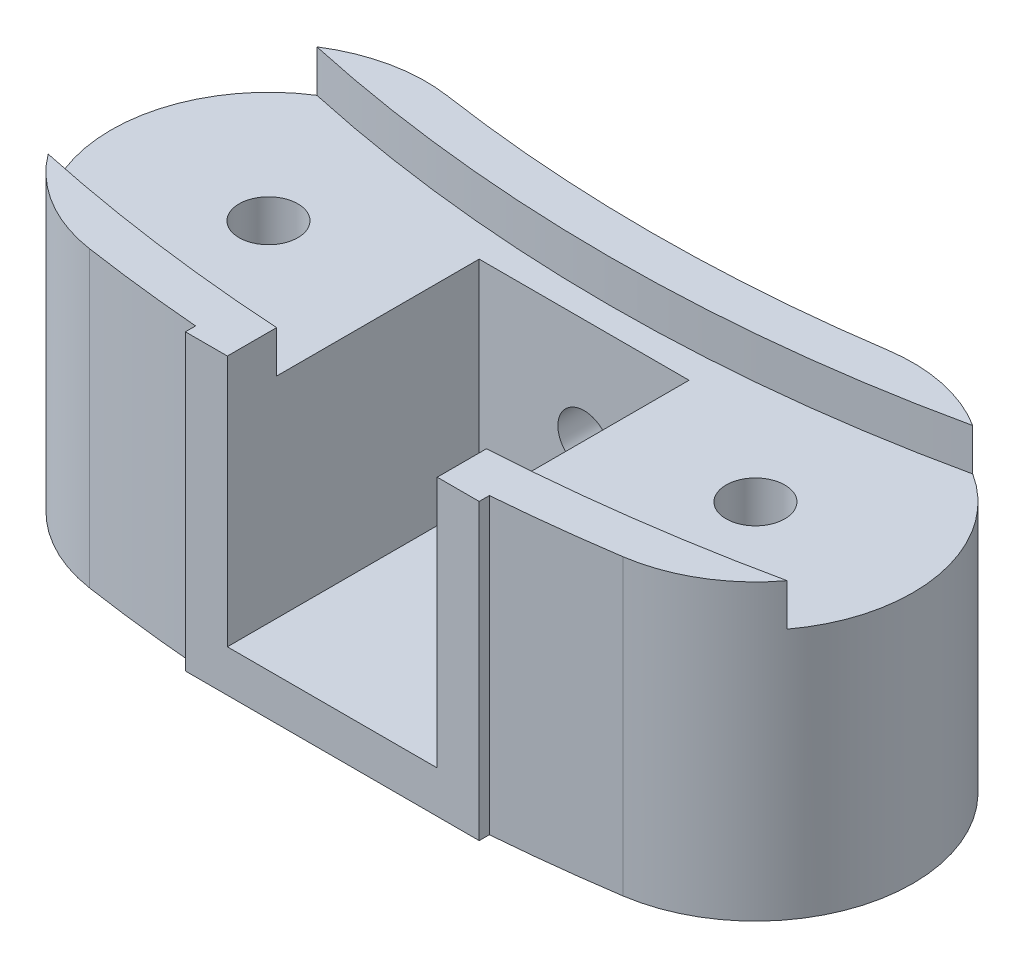
ISO-10303-21;
HEADER;
FILE_DESCRIPTION(('STEP AP214'),'2;1');
FILE_NAME('part.step','',(''),(''),'','','');
FILE_SCHEMA(('AUTOMOTIVE_DESIGN { 1 0 10303 214 1 1 1 1 }'));
ENDSEC;
DATA;
#1=APPLICATION_CONTEXT('core data for automotive mechanical design processes');
#2=APPLICATION_PROTOCOL_DEFINITION('international standard','automotive_design',2000,#1);
#3=PRODUCT_CONTEXT('',#1,'mechanical');
#4=PRODUCT('Part','Part','',(#3));
#5=PRODUCT_RELATED_PRODUCT_CATEGORY('part','',(#4));
#6=PRODUCT_DEFINITION_FORMATION('','',#4);
#7=PRODUCT_DEFINITION_CONTEXT('part definition',#1,'design');
#8=PRODUCT_DEFINITION('design','',#6,#7);
#9=PRODUCT_DEFINITION_SHAPE('','',#8);
#10=(LENGTH_UNIT() NAMED_UNIT(*) SI_UNIT(.MILLI.,.METRE.));
#11=(NAMED_UNIT(*) PLANE_ANGLE_UNIT() SI_UNIT($,.RADIAN.));
#12=(NAMED_UNIT(*) SI_UNIT($,.STERADIAN.) SOLID_ANGLE_UNIT());
#13=UNCERTAINTY_MEASURE_WITH_UNIT(LENGTH_MEASURE(1.E-05),#10,'distance_accuracy_value','');
#14=(GEOMETRIC_REPRESENTATION_CONTEXT(3) GLOBAL_UNCERTAINTY_ASSIGNED_CONTEXT((#13)) GLOBAL_UNIT_ASSIGNED_CONTEXT((#10,
#11,#12)) REPRESENTATION_CONTEXT('',''));
#15=CARTESIAN_POINT('',(0.,0.,0.));
#16=DIRECTION('',(0.,0.,1.));
#17=DIRECTION('',(1.,0.,0.));
#18=AXIS2_PLACEMENT_3D('',#15,#16,#17);
#19=CARTESIAN_POINT('',(0.,14.,-78.5));
#20=DIRECTION('',(0.,-1.,0.));
#21=DIRECTION('',(0.,0.,-1.));
#22=AXIS2_PLACEMENT_3D('',#19,#20,#21);
#23=CYLINDRICAL_SURFACE('',#22,84.);
#24=DIRECTION('',(0.,-1.,0.));
#25=VECTOR('',#24,1.);
#26=CARTESIAN_POINT('',(5.00000000000002,14.,5.35105843100611));
#27=LINE('',#26,#25);
#28=CARTESIAN_POINT('',(5.00000000000002,14.,5.35105843100611));
#29=VERTEX_POINT('',#28);
#30=CARTESIAN_POINT('',(5.00000000000002,12.,5.35105843100611));
#31=VERTEX_POINT('',#30);
#32=EDGE_CURVE('E202',#29,#31,#27,.T.);
#33=ORIENTED_EDGE('',*,*,#32,.F.);
#34=CARTESIAN_POINT('',(0.,14.,-78.5));
#35=DIRECTION('',(0.,1.,0.));
#36=DIRECTION('',(0.,0.,1.));
#37=AXIS2_PLACEMENT_3D('',#34,#35,#36);
#38=CIRCLE('',#37,84.);
#39=CARTESIAN_POINT('',(17.60562734347,14.,3.63429177781265));
#40=VERTEX_POINT('',#39);
#41=EDGE_CURVE('E236',#29,#40,#38,.T.);
#42=ORIENTED_EDGE('',*,*,#41,.T.);
#43=DIRECTION('',(0.,-1.,0.));
#44=VECTOR('',#43,1.);
#45=CARTESIAN_POINT('',(17.60562734347,14.,3.63429177781265));
#46=LINE('',#45,#44);
#47=CARTESIAN_POINT('',(17.60562734347,12.,3.63429177781265));
#48=VERTEX_POINT('',#47);
#49=EDGE_CURVE('E246',#40,#48,#46,.T.);
#50=ORIENTED_EDGE('',*,*,#49,.T.);
#51=CARTESIAN_POINT('',(0.,12.,-78.5));
#52=DIRECTION('',(0.,1.,0.));
#53=DIRECTION('',(0.,0.,1.));
#54=AXIS2_PLACEMENT_3D('',#51,#52,#53);
#55=CIRCLE('',#54,84.);
#56=EDGE_CURVE('E224',#31,#48,#55,.T.);
#57=ORIENTED_EDGE('',*,*,#56,.F.);
#58=EDGE_LOOP('',(#33,#42,#50,#57));
#59=FACE_BOUND('',#58,.T.);
#60=ADVANCED_FACE('F39',(#59),#23,.F.);
#61=CARTESIAN_POINT('',(0.,14.,0.));
#62=DIRECTION('',(0.,1.,0.));
#63=DIRECTION('',(0.,0.,1.));
#64=AXIS2_PLACEMENT_3D('',#61,#62,#63);
#65=PLANE('',#64);
#66=DIRECTION('',(0.,0.,1.));
#67=VECTOR('',#66,1.);
#68=CARTESIAN_POINT('',(5.00000000000002,14.,-4.3));
#69=LINE('',#68,#67);
#70=CARTESIAN_POINT('',(5.00000000000002,14.,7.7));
#71=VERTEX_POINT('',#70);
#72=EDGE_CURVE('E184',#29,#71,#69,.T.);
#73=ORIENTED_EDGE('',*,*,#72,.T.);
#74=DIRECTION('',(-1.,0.,0.));
#75=VECTOR('',#74,1.);
#76=CARTESIAN_POINT('',(0.,14.,7.7));
#77=LINE('',#76,#75);
#78=CARTESIAN_POINT('',(7.00000000000003,14.,7.7));
#79=VERTEX_POINT('',#78);
#80=EDGE_CURVE('E218',#79,#71,#77,.T.);
#81=ORIENTED_EDGE('',*,*,#80,.F.);
#82=DIRECTION('',(0.,0.,1.));
#83=VECTOR('',#82,1.);
#84=CARTESIAN_POINT('',(7.00000000000003,14.,-500000.));
#85=LINE('',#84,#83);
#86=CARTESIAN_POINT('',(7.00000000000003,14.,7.21464285639883));
#87=VERTEX_POINT('',#86);
#88=EDGE_CURVE('E62',#87,#79,#85,.T.);
#89=ORIENTED_EDGE('',*,*,#88,.F.);
#90=CARTESIAN_POINT('',(0.,14.,-78.5));
#91=DIRECTION('',(0.,1.,0.));
#92=DIRECTION('',(0.,0.,1.));
#93=AXIS2_PLACEMENT_3D('',#90,#91,#92);
#94=CIRCLE('',#93,86.);
#95=CARTESIAN_POINT('',(12.711609357146,14.,6.55536424912499));
#96=VERTEX_POINT('',#95);
#97=EDGE_CURVE('E239',#87,#96,#94,.T.);
#98=ORIENTED_EDGE('',*,*,#97,.T.);
#99=CARTESIAN_POINT('',(11.6030387736739,14.,-0.862254726089445));
#100=DIRECTION('',(0.,1.,0.));
#101=DIRECTION('',(0.,0.,1.));
#102=AXIS2_PLACEMENT_3D('',#99,#100,#101);
#103=CIRCLE('',#102,7.50000000000006);
#104=EDGE_CURVE('E243',#96,#40,#103,.T.);
#105=ORIENTED_EDGE('',*,*,#104,.T.);
#106=ORIENTED_EDGE('',*,*,#41,.F.);
#107=EDGE_LOOP('',(#73,#81,#89,#98,#105,#106));
#108=FACE_BOUND('',#107,.T.);
#109=ADVANCED_FACE('F385',(#108),#65,.T.);
#110=CARTESIAN_POINT('',(0.,12.,-78.5));
#111=DIRECTION('',(0.,-1.,0.));
#112=DIRECTION('',(0.,0.,-1.));
#113=AXIS2_PLACEMENT_3D('',#110,#111,#112);
#114=CYLINDRICAL_SURFACE('',#113,86.);
#115=ORIENTED_EDGE('',*,*,#97,.F.);
#116=DIRECTION('',(0.,-1.,0.));
#117=VECTOR('',#116,1.);
#118=CARTESIAN_POINT('',(7.00000000000003,12.,7.21464285639883));
#119=LINE('',#118,#117);
#120=CARTESIAN_POINT('',(7.00000000000002,0.,7.21464285639883));
#121=VERTEX_POINT('',#120);
#122=EDGE_CURVE('E206',#121,#87,#119,.F.);
#123=ORIENTED_EDGE('',*,*,#122,.F.);
#124=CARTESIAN_POINT('',(0.,0.,-78.5));
#125=DIRECTION('',(0.,1.,0.));
#126=DIRECTION('',(0.,0.,1.));
#127=AXIS2_PLACEMENT_3D('',#124,#125,#126);
#128=CIRCLE('',#127,86.);
#129=CARTESIAN_POINT('',(12.711609357146,0.,6.55536424912495));
#130=VERTEX_POINT('',#129);
#131=EDGE_CURVE('E285',#121,#130,#128,.T.);
#132=ORIENTED_EDGE('',*,*,#131,.T.);
#133=DIRECTION('',(0.,-1.,0.));
#134=VECTOR('',#133,1.);
#135=CARTESIAN_POINT('',(12.711609357146,12.,6.55536424912495));
#136=LINE('',#135,#134);
#137=EDGE_CURVE('E47',#96,#130,#136,.T.);
#138=ORIENTED_EDGE('',*,*,#137,.F.);
#139=EDGE_LOOP('',(#115,#123,#132,#138));
#140=FACE_BOUND('',#139,.T.);
#141=ADVANCED_FACE('F321',(#140),#114,.T.);
#142=CARTESIAN_POINT('',(0.,12.,0.));
#143=DIRECTION('',(0.,1.,0.));
#144=DIRECTION('',(0.,0.,1.));
#145=AXIS2_PLACEMENT_3D('',#142,#143,#144);
#146=PLANE('',#145);
#147=DIRECTION('',(0.,0.,-1.));
#148=VECTOR('',#147,1.);
#149=CARTESIAN_POINT('',(5.00000000000002,12.,0.));
#150=LINE('',#149,#148);
#151=CARTESIAN_POINT('',(5.00000000000002,12.,-4.3));
#152=VERTEX_POINT('',#151);
#153=EDGE_CURVE('E204',#31,#152,#150,.T.);
#154=ORIENTED_EDGE('',*,*,#153,.F.);
#155=ORIENTED_EDGE('',*,*,#56,.T.);
#156=CARTESIAN_POINT('',(11.6030387736739,12.,-0.862254726089445));
#157=DIRECTION('',(0.,1.,0.));
#158=DIRECTION('',(0.,0.,1.));
#159=AXIS2_PLACEMENT_3D('',#156,#157,#158);
#160=CIRCLE('',#159,7.50000000000006);
#161=CARTESIAN_POINT('',(15.6259874786886,12.,-7.19201646858981));
#162=VERTEX_POINT('',#161);
#163=EDGE_CURVE('E287',#48,#162,#160,.T.);
#164=ORIENTED_EDGE('',*,*,#163,.T.);
#165=CARTESIAN_POINT('',(0.,12.,-78.5));
#166=DIRECTION('',(0.,1.,0.));
#167=DIRECTION('',(0.,0.,1.));
#168=AXIS2_PLACEMENT_3D('',#165,#166,#167);
#169=CIRCLE('',#168,73.);
#170=CARTESIAN_POINT('',(-15.6259874786886,12.,-7.19201646858981));
#171=VERTEX_POINT('',#170);
#172=EDGE_CURVE('E255',#171,#162,#169,.T.);
#173=ORIENTED_EDGE('',*,*,#172,.F.);
#174=CARTESIAN_POINT('',(-11.6030387736739,12.,-0.862254726089445));
#175=DIRECTION('',(0.,1.,0.));
#176=DIRECTION('',(0.,0.,1.));
#177=AXIS2_PLACEMENT_3D('',#174,#175,#176);
#178=CIRCLE('',#177,7.50000000000004);
#179=CARTESIAN_POINT('',(-17.6056273434699,12.,3.63429177781266));
#180=VERTEX_POINT('',#179);
#181=EDGE_CURVE('E276',#171,#180,#178,.T.);
#182=ORIENTED_EDGE('',*,*,#181,.T.);
#183=CARTESIAN_POINT('',(-4.99999999999997,12.,5.35105843100611));
#184=VERTEX_POINT('',#183);
#185=EDGE_CURVE('E247',#180,#184,#55,.T.);
#186=ORIENTED_EDGE('',*,*,#185,.T.);
#187=DIRECTION('',(0.,0.,1.));
#188=VECTOR('',#187,1.);
#189=CARTESIAN_POINT('',(-4.99999999999997,12.,0.));
#190=LINE('',#189,#188);
#191=CARTESIAN_POINT('',(-4.99999999999997,12.,-4.3));
#192=VERTEX_POINT('',#191);
#193=EDGE_CURVE('E200',#192,#184,#190,.T.);
#194=ORIENTED_EDGE('',*,*,#193,.F.);
#195=DIRECTION('',(1.,0.,0.));
#196=VECTOR('',#195,1.);
#197=CARTESIAN_POINT('',(0.,12.,-4.3));
#198=LINE('',#197,#196);
#199=EDGE_CURVE('E11',#192,#152,#198,.T.);
#200=ORIENTED_EDGE('',*,*,#199,.T.);
#201=EDGE_LOOP('',(#154,#155,#164,#173,#182,#186,#194,#200));
#202=FACE_BOUND('',#201,.T.);
#203=CARTESIAN_POINT('',(-11.6030387736739,12.,-0.862254726089445));
#204=DIRECTION('',(0.,1.,0.));
#205=DIRECTION('',(0.,0.,1.));
#206=AXIS2_PLACEMENT_3D('',#203,#204,#205);
#207=CIRCLE('',#206,1.4);
#208=CARTESIAN_POINT('',(-11.6030387736739,12.,0.537745273910554));
#209=VERTEX_POINT('',#208);
#210=EDGE_CURVE('E306',#209,#209,#207,.T.);
#211=ORIENTED_EDGE('',*,*,#210,.F.);
#212=EDGE_LOOP('',(#211));
#213=FACE_BOUND('',#212,.T.);
#214=CARTESIAN_POINT('',(11.6030387736739,12.,-0.862254726089445));
#215=DIRECTION('',(0.,1.,0.));
#216=DIRECTION('',(0.,0.,1.));
#217=AXIS2_PLACEMENT_3D('',#214,#215,#216);
#218=CIRCLE('',#217,1.4);
#219=CARTESIAN_POINT('',(11.6030387736739,12.,0.537745273910554));
#220=VERTEX_POINT('',#219);
#221=EDGE_CURVE('E291',#220,#220,#218,.T.);
#222=ORIENTED_EDGE('',*,*,#221,.F.);
#223=EDGE_LOOP('',(#222));
#224=FACE_BOUND('',#223,.T.);
#225=ADVANCED_FACE('F360',(#202,#213,#224),#146,.T.);
#226=CARTESIAN_POINT('',(-12.7116093571459,0.,6.55536424912497));
#227=VERTEX_POINT('',#226);
#228=CARTESIAN_POINT('',(-6.99999999999997,0.,7.21464285639883));
#229=VERTEX_POINT('',#228);
#230=EDGE_CURVE('E325',#227,#229,#128,.T.);
#231=ORIENTED_EDGE('',*,*,#230,.T.);
#232=DIRECTION('',(0.,-1.,0.));
#233=VECTOR('',#232,1.);
#234=CARTESIAN_POINT('',(-6.99999999999997,12.,7.21464285639883));
#235=LINE('',#234,#233);
#236=CARTESIAN_POINT('',(-6.99999999999997,14.,7.21464285641105));
#237=VERTEX_POINT('',#236);
#238=EDGE_CURVE('E208',#237,#229,#235,.T.);
#239=ORIENTED_EDGE('',*,*,#238,.F.);
#240=CARTESIAN_POINT('',(-12.7116093571459,14.,6.55536424912498));
#241=VERTEX_POINT('',#240);
#242=EDGE_CURVE('E240',#241,#237,#94,.T.);
#243=ORIENTED_EDGE('',*,*,#242,.F.);
#244=DIRECTION('',(0.,-1.,0.));
#245=VECTOR('',#244,1.);
#246=CARTESIAN_POINT('',(-12.7116093571459,12.,6.55536424912497));
#247=LINE('',#246,#245);
#248=EDGE_CURVE('E302',#241,#227,#247,.T.);
#249=ORIENTED_EDGE('',*,*,#248,.T.);
#250=EDGE_LOOP('',(#231,#239,#243,#249));
#251=FACE_BOUND('',#250,.T.);
#252=ADVANCED_FACE('F41',(#251),#114,.T.);
#253=CARTESIAN_POINT('',(11.6030387736739,12.,-0.862254726089445));
#254=DIRECTION('',(0.,-1.,0.));
#255=DIRECTION('',(0.,0.,-1.));
#256=AXIS2_PLACEMENT_3D('',#253,#254,#255);
#257=CYLINDRICAL_SURFACE('',#256,7.50000000000006);
#258=CARTESIAN_POINT('',(11.6030387736739,0.,-0.862254726089445));
#259=DIRECTION('',(0.,1.,0.));
#260=DIRECTION('',(0.,0.,1.));
#261=AXIS2_PLACEMENT_3D('',#258,#259,#260);
#262=CIRCLE('',#261,7.50000000000006);
#263=CARTESIAN_POINT('',(10.4944681902019,0.,-8.27987370130388));
#264=VERTEX_POINT('',#263);
#265=EDGE_CURVE('E316',#130,#264,#262,.T.);
#266=ORIENTED_EDGE('',*,*,#265,.T.);
#267=DIRECTION('',(0.,-1.,0.));
#268=VECTOR('',#267,1.);
#269=CARTESIAN_POINT('',(10.4944681902019,12.,-8.27987370130388));
#270=LINE('',#269,#268);
#271=CARTESIAN_POINT('',(10.4944681902019,14.,-8.27987370130388));
#272=VERTEX_POINT('',#271);
#273=EDGE_CURVE('E308',#272,#264,#270,.T.);
#274=ORIENTED_EDGE('',*,*,#273,.F.);
#275=CARTESIAN_POINT('',(11.6030387736739,14.,-0.862254726089445));
#276=DIRECTION('',(0.,1.,0.));
#277=DIRECTION('',(0.,0.,1.));
#278=AXIS2_PLACEMENT_3D('',#275,#276,#277);
#279=CIRCLE('',#278,7.50000000000006);
#280=CARTESIAN_POINT('',(15.6259874786886,14.,-7.19201646858981));
#281=VERTEX_POINT('',#280);
#282=EDGE_CURVE('E261',#281,#272,#279,.T.);
#283=ORIENTED_EDGE('',*,*,#282,.F.);
#284=DIRECTION('',(0.,-1.,0.));
#285=VECTOR('',#284,1.);
#286=CARTESIAN_POINT('',(15.6259874786886,14.,-7.19201646858981));
#287=LINE('',#286,#285);
#288=EDGE_CURVE('E267',#281,#162,#287,.T.);
#289=ORIENTED_EDGE('',*,*,#288,.T.);
#290=ORIENTED_EDGE('',*,*,#163,.F.);
#291=ORIENTED_EDGE('',*,*,#49,.F.);
#292=ORIENTED_EDGE('',*,*,#104,.F.);
#293=ORIENTED_EDGE('',*,*,#137,.T.);
#294=EDGE_LOOP('',(#266,#274,#283,#289,#290,#291,#292,#293));
#295=FACE_BOUND('',#294,.T.);
#296=ADVANCED_FACE('F314',(#295),#257,.T.);
#297=CARTESIAN_POINT('',(0.,12.,-78.5));
#298=DIRECTION('',(0.,-1.,0.));
#299=DIRECTION('',(0.,0.,-1.));
#300=AXIS2_PLACEMENT_3D('',#297,#298,#299);
#301=CYLINDRICAL_SURFACE('',#300,71.);
#302=CARTESIAN_POINT('',(1.25000000000003,7.,-7.51100437391726));
#303=CARTESIAN_POINT('',(1.24999688842205,6.92979278913981,-7.51100422520481));
#304=CARTESIAN_POINT('',(1.24406528767097,6.85953480990963,-7.51089910432757));
#305=CARTESIAN_POINT('',(1.22048549156561,6.72095419328383,-7.51048986749532));
#306=CARTESIAN_POINT('',(1.20282323038994,6.65263398206787,-7.51018551265219));
#307=CARTESIAN_POINT('',(1.15628543256579,6.51995661524136,-7.50941229634405));
#308=CARTESIAN_POINT('',(1.12741529651918,6.45559756819087,-7.50894351412013));
#309=CARTESIAN_POINT('',(1.05928879801176,6.33265773804737,-7.50789436724565));
#310=CARTESIAN_POINT('',(1.02003500190577,6.2740755320941,-7.50731403017588));
#311=CARTESIAN_POINT('',(0.932243025008267,6.16431936234301,-7.50610698961435));
#312=CARTESIAN_POINT('',(0.883702975336184,6.11314689342064,-7.50548027680495));
#313=CARTESIAN_POINT('',(0.778718848679505,6.01967510782004,-7.50425120565388));
#314=CARTESIAN_POINT('',(0.722274459943448,5.97737614128205,-7.50364884827401));
#315=CARTESIAN_POINT('',(0.603082016770651,5.90285259519921,-7.5025363913319));
#316=CARTESIAN_POINT('',(0.540333670742071,5.87062848195412,-7.50202629604032));
#317=CARTESIAN_POINT('',(0.410316676064576,5.81717258237521,-7.50115590891516));
#318=CARTESIAN_POINT('',(0.343048039614668,5.79594076637759,-7.50079561667731));
#319=CARTESIAN_POINT('',(0.205907278126492,5.76507418668653,-7.50026548566869));
#320=CARTESIAN_POINT('',(0.136035422456058,5.75543822653017,-7.50009562724903));
#321=CARTESIAN_POINT('',(-0.00433435161981534,5.74803321806721,-7.49996544731362));
#322=CARTESIAN_POINT('',(-0.0748322684248432,5.7502641394338,-7.50000512526237));
#323=CARTESIAN_POINT('',(-0.214444852538094,5.76652850971003,-7.50028952734259));
#324=CARTESIAN_POINT('',(-0.283559671892976,5.78056065390924,-7.50053422880721));
#325=CARTESIAN_POINT('',(-0.418452476356223,5.82002713813014,-7.50120106720325));
#326=CARTESIAN_POINT('',(-0.484230456625064,5.84546149468829,-7.501623204392));
#327=CARTESIAN_POINT('',(-0.61058649963697,5.90701190206607,-7.50259736596158));
#328=CARTESIAN_POINT('',(-0.671164270895859,5.94312855115003,-7.50314939761682));
#329=CARTESIAN_POINT('',(-0.785397074796804,6.0250178502278,-7.50432111914328));
#330=CARTESIAN_POINT('',(-0.839052103825442,6.07079050526165,-7.50494080904981));
#331=CARTESIAN_POINT('',(-0.937923972408961,6.17069989152889,-7.5061780909636));
#332=CARTESIAN_POINT('',(-0.983139664889825,6.22483775793597,-7.50679568267448));
#333=CARTESIAN_POINT('',(-1.06384050539545,6.33993676066445,-7.50795905505379));
#334=CARTESIAN_POINT('',(-1.09932565205274,6.40089789794476,-7.50850483571212));
#335=CARTESIAN_POINT('',(-1.1595579508033,6.5279135711477,-7.50946304448495));
#336=CARTESIAN_POINT('',(-1.18430506820848,6.59396812352327,-7.50987547216867));
#337=CARTESIAN_POINT('',(-1.22235808952035,6.72929526210562,-7.51052045579495));
#338=CARTESIAN_POINT('',(-1.23566400449454,6.7985678451994,-7.51075301191152));
#339=CARTESIAN_POINT('',(-1.25045550712884,6.93835464908504,-7.51101200196969));
#340=CARTESIAN_POINT('',(-1.25194268185205,7.00886870189332,-7.51103846358641));
#341=CARTESIAN_POINT('',(-1.24305862136407,7.149145528319,-7.51088235337751));
#342=CARTESIAN_POINT('',(-1.23268739053102,7.21890830221377,-7.51069978162908));
#343=CARTESIAN_POINT('',(-1.2003822380071,7.35569780870334,-7.51014621264025));
#344=CARTESIAN_POINT('',(-1.1784490353244,7.42272471115546,-7.50977522711687));
#345=CARTESIAN_POINT('',(-1.12364328507968,7.55214499723449,-7.50888666482514));
#346=CARTESIAN_POINT('',(-1.09077073085785,7.61453837804051,-7.50836908796754));
#347=CARTESIAN_POINT('',(-1.01501533093182,7.73292778555266,-7.50724562597082));
#348=CARTESIAN_POINT('',(-0.972131416138788,7.78892312807601,-7.50663973140306));
#349=CARTESIAN_POINT('',(-0.877572192202867,7.8929200754622,-7.50540797487114));
#350=CARTESIAN_POINT('',(-0.825896873007661,7.94092167118466,-7.50478211288416));
#351=CARTESIAN_POINT('',(-0.715214944337296,8.02757378639129,-7.5035808997032));
#352=CARTESIAN_POINT('',(-0.65620753257768,8.06622328119365,-7.50300555404854));
#353=CARTESIAN_POINT('',(-0.532540600520889,8.13306703071484,-7.50197031525268));
#354=CARTESIAN_POINT('',(-0.467881088527499,8.16126130079365,-7.50151042194186));
#355=CARTESIAN_POINT('',(-0.334749288320584,8.206392491081,-7.50075796068834));
#356=CARTESIAN_POINT('',(-0.266277226717643,8.22333007959247,-7.50046538281236));
#357=CARTESIAN_POINT('',(-0.127460724199695,8.24546930999093,-7.50008049701797));
#358=CARTESIAN_POINT('',(-0.0571162816368326,8.25067094154893,-7.49998818927583));
#359=CARTESIAN_POINT('',(0.0834377232625185,8.24919049097113,-7.5000142502251));
#360=CARTESIAN_POINT('',(0.153647302753308,8.24251003639585,-7.50013259006285));
#361=CARTESIAN_POINT('',(0.291948312371198,8.21745836742194,-7.50056655057388));
#362=CARTESIAN_POINT('',(0.360039738257727,8.19908712961978,-7.50088217164211));
#363=CARTESIAN_POINT('',(0.492172889140184,8.15117533183136,-7.50167512730847));
#364=CARTESIAN_POINT('',(0.556214540271119,8.12163456818948,-7.50215246485519));
#365=CARTESIAN_POINT('',(0.678427263499425,8.0522236646296,-7.50321503229745));
#366=CARTESIAN_POINT('',(0.736598559709453,8.01235391924878,-7.50380025807171));
#367=CARTESIAN_POINT('',(0.845424816220969,7.92341518837505,-7.50501268428606));
#368=CARTESIAN_POINT('',(0.896079546717079,7.87434592172721,-7.50563988600863));
#369=CARTESIAN_POINT('',(0.988445260853025,7.76838541648867,-7.50686571306417));
#370=CARTESIAN_POINT('',(1.03015402131164,7.71149223931368,-7.50746433126512));
#371=CARTESIAN_POINT('',(1.10344643857374,7.59148476792299,-7.5085656260473));
#372=CARTESIAN_POINT('',(1.13502465580114,7.52836715520799,-7.50906825102675));
#373=CARTESIAN_POINT('',(1.18709970501018,7.3977745579441,-7.5099198548549));
#374=CARTESIAN_POINT('',(1.20760979736134,7.330304896482,-7.51026901746849));
#375=CARTESIAN_POINT('',(1.23151067282413,7.21867212005436,-7.51068066437849));
#376=CARTESIAN_POINT('',(1.23843549294434,7.17523410761338,-7.51080153098356));
#377=CARTESIAN_POINT('',(1.24768113012815,7.08787069371672,-7.51096343229128));
#378=CARTESIAN_POINT('',(1.25000194765187,7.04394529230976,-7.51100446700189));
#379=CARTESIAN_POINT('',(1.25000000000003,7.,-7.51100437391726));
#380=B_SPLINE_CURVE_WITH_KNOTS('',3,(#302,#303,#304,#305,#306,#307,#308,#309,#310,#311,#312,
#313,#314,#315,#316,#317,#318,#319,#320,#321,#322,#323,#324,#325,#326,#327,#328,#329,#330,#331,
#332,#333,#334,#335,#336,#337,#338,#339,#340,#341,#342,#343,#344,#345,#346,#347,#348,#349,#350,
#351,#352,#353,#354,#355,#356,#357,#358,#359,#360,#361,#362,#363,#364,#365,#366,#367,#368,#369,
#370,#371,#372,#373,#374,#375,#376,#377,#378,#379),.UNSPECIFIED.,.T.,.F.,(4,2,2,2,2,2,2,2,2,2,2,
2,2,2,2,2,2,2,2,2,2,2,2,2,2,2,2,2,2,2,2,2,2,2,2,2,2,2,4),(0.,0.210461230375783,
0.421175274092928,0.631787909378986,0.842348539634358,1.05295159037941,1.26356294976473,
1.4741840555444,1.68480459293909,1.89540339659711,2.10600166205256,2.31657664740886,
2.52715193815994,2.73773902446408,2.94832622068654,3.1589420190948,3.36955784710163,
3.58017435547605,3.79079066011347,4.00137868195542,4.21196662604813,4.42254147578328,
4.63311645371524,4.84371392873075,5.05431164455037,5.26493242449593,5.47555289501308,
5.68616085999241,5.89676901033083,6.10734831463096,6.31792804048646,6.52851160605832,
6.73908712913341,6.94966908884772,7.16030332023448,7.37105046270736,7.58154455197223,
7.71328004038917,7.84501551564048),.UNSPECIFIED.);
#381=CARTESIAN_POINT('',(1.25000000000003,7.,-7.51100437391726));
#382=VERTEX_POINT('',#381);
#383=EDGE_CURVE('E192',#382,#382,#380,.T.);
#384=ORIENTED_EDGE('',*,*,#383,.F.);
#385=EDGE_LOOP('',(#384));
#386=FACE_BOUND('',#385,.T.);
#387=CARTESIAN_POINT('',(0.,0.,-78.5));
#388=DIRECTION('',(0.,1.,0.));
#389=DIRECTION('',(0.,0.,1.));
#390=AXIS2_PLACEMENT_3D('',#387,#388,#389);
#391=CIRCLE('',#390,71.);
#392=CARTESIAN_POINT('',(-10.4944681902018,0.,-8.27987370130388));
#393=VERTEX_POINT('',#392);
#394=EDGE_CURVE('E332',#393,#264,#391,.T.);
#395=ORIENTED_EDGE('',*,*,#394,.F.);
#396=DIRECTION('',(0.,-1.,0.));
#397=VECTOR('',#396,1.);
#398=CARTESIAN_POINT('',(-10.4944681902018,12.,-8.27987370130388));
#399=LINE('',#398,#397);
#400=CARTESIAN_POINT('',(-10.4944681902018,14.,-8.27987370130388));
#401=VERTEX_POINT('',#400);
#402=EDGE_CURVE('E305',#401,#393,#399,.T.);
#403=ORIENTED_EDGE('',*,*,#402,.F.);
#404=CARTESIAN_POINT('',(0.,14.,-78.5));
#405=DIRECTION('',(0.,1.,0.));
#406=DIRECTION('',(0.,0.,1.));
#407=AXIS2_PLACEMENT_3D('',#404,#405,#406);
#408=CIRCLE('',#407,71.);
#409=EDGE_CURVE('E264',#272,#401,#408,.F.);
#410=ORIENTED_EDGE('',*,*,#409,.F.);
#411=ORIENTED_EDGE('',*,*,#273,.T.);
#412=EDGE_LOOP('',(#395,#403,#410,#411));
#413=FACE_BOUND('',#412,.T.);
#414=ADVANCED_FACE('F370',(#386,#413),#301,.F.);
#415=CARTESIAN_POINT('',(11.6030387736739,12.,-0.862254726089445));
#416=DIRECTION('',(0.,-1.,0.));
#417=DIRECTION('',(0.,0.,-1.));
#418=AXIS2_PLACEMENT_3D('',#415,#416,#417);
#419=CYLINDRICAL_SURFACE('',#418,1.4);
#420=ORIENTED_EDGE('',*,*,#221,.T.);
#421=EDGE_LOOP('',(#420));
#422=FACE_BOUND('',#421,.T.);
#423=CARTESIAN_POINT('',(11.6030387736739,0.,-0.862254726089445));
#424=DIRECTION('',(0.,1.,0.));
#425=DIRECTION('',(0.,0.,1.));
#426=AXIS2_PLACEMENT_3D('',#423,#424,#425);
#427=CIRCLE('',#426,1.4);
#428=CARTESIAN_POINT('',(11.6030387736739,0.,0.537745273910554));
#429=VERTEX_POINT('',#428);
#430=EDGE_CURVE('E293',#429,#429,#427,.T.);
#431=ORIENTED_EDGE('',*,*,#430,.F.);
#432=EDGE_LOOP('',(#431));
#433=FACE_BOUND('',#432,.T.);
#434=ADVANCED_FACE('F372',(#422,#433),#419,.F.);
#435=CARTESIAN_POINT('',(-11.6030387736739,12.,-0.862254726089445));
#436=DIRECTION('',(0.,-1.,0.));
#437=DIRECTION('',(0.,0.,-1.));
#438=AXIS2_PLACEMENT_3D('',#435,#436,#437);
#439=CYLINDRICAL_SURFACE('',#438,7.50000000000004);
#440=CARTESIAN_POINT('',(-11.6030387736739,0.,-0.862254726089445));
#441=DIRECTION('',(0.,1.,0.));
#442=DIRECTION('',(0.,0.,1.));
#443=AXIS2_PLACEMENT_3D('',#440,#441,#442);
#444=CIRCLE('',#443,7.50000000000004);
#445=EDGE_CURVE('E298',#393,#227,#444,.T.);
#446=ORIENTED_EDGE('',*,*,#445,.T.);
#447=ORIENTED_EDGE('',*,*,#248,.F.);
#448=CARTESIAN_POINT('',(-11.6030387736739,14.,-0.862254726089445));
#449=DIRECTION('',(0.,1.,0.));
#450=DIRECTION('',(0.,0.,1.));
#451=AXIS2_PLACEMENT_3D('',#448,#449,#450);
#452=CIRCLE('',#451,7.50000000000004);
#453=CARTESIAN_POINT('',(-17.6056273434699,14.,3.63429177781266));
#454=VERTEX_POINT('',#453);
#455=EDGE_CURVE('E235',#454,#241,#452,.T.);
#456=ORIENTED_EDGE('',*,*,#455,.F.);
#457=DIRECTION('',(0.,-1.,0.));
#458=VECTOR('',#457,1.);
#459=CARTESIAN_POINT('',(-17.6056273434699,14.,3.63429177781266));
#460=LINE('',#459,#458);
#461=EDGE_CURVE('E252',#454,#180,#460,.T.);
#462=ORIENTED_EDGE('',*,*,#461,.T.);
#463=ORIENTED_EDGE('',*,*,#181,.F.);
#464=DIRECTION('',(0.,-1.,0.));
#465=VECTOR('',#464,1.);
#466=CARTESIAN_POINT('',(-15.6259874786886,14.,-7.19201646858981));
#467=LINE('',#466,#465);
#468=CARTESIAN_POINT('',(-15.6259874786886,14.,-7.19201646858981));
#469=VERTEX_POINT('',#468);
#470=EDGE_CURVE('E280',#469,#171,#467,.T.);
#471=ORIENTED_EDGE('',*,*,#470,.F.);
#472=CARTESIAN_POINT('',(-11.6030387736739,14.,-0.862254726089445));
#473=DIRECTION('',(0.,1.,0.));
#474=DIRECTION('',(0.,0.,1.));
#475=AXIS2_PLACEMENT_3D('',#472,#473,#474);
#476=CIRCLE('',#475,7.50000000000004);
#477=EDGE_CURVE('E256',#401,#469,#476,.T.);
#478=ORIENTED_EDGE('',*,*,#477,.F.);
#479=ORIENTED_EDGE('',*,*,#402,.T.);
#480=EDGE_LOOP('',(#446,#447,#456,#462,#463,#471,#478,#479));
#481=FACE_BOUND('',#480,.T.);
#482=ADVANCED_FACE('F338',(#481),#439,.T.);
#483=CARTESIAN_POINT('',(-11.6030387736739,12.,-0.862254726089445));
#484=DIRECTION('',(0.,-1.,0.));
#485=DIRECTION('',(0.,0.,-1.));
#486=AXIS2_PLACEMENT_3D('',#483,#484,#485);
#487=CYLINDRICAL_SURFACE('',#486,1.4);
#488=ORIENTED_EDGE('',*,*,#210,.T.);
#489=EDGE_LOOP('',(#488));
#490=FACE_BOUND('',#489,.T.);
#491=CARTESIAN_POINT('',(-11.6030387736739,0.,-0.862254726089445));
#492=DIRECTION('',(0.,1.,0.));
#493=DIRECTION('',(0.,0.,1.));
#494=AXIS2_PLACEMENT_3D('',#491,#492,#493);
#495=CIRCLE('',#494,1.4);
#496=CARTESIAN_POINT('',(-11.6030387736739,0.,0.537745273910554));
#497=VERTEX_POINT('',#496);
#498=EDGE_CURVE('E288',#497,#497,#495,.T.);
#499=ORIENTED_EDGE('',*,*,#498,.F.);
#500=EDGE_LOOP('',(#499));
#501=FACE_BOUND('',#500,.T.);
#502=ADVANCED_FACE('F409',(#490,#501),#487,.F.);
#503=CARTESIAN_POINT('',(0.,0.,0.));
#504=DIRECTION('',(0.,1.,0.));
#505=DIRECTION('',(0.,0.,1.));
#506=AXIS2_PLACEMENT_3D('',#503,#504,#505);
#507=PLANE('',#506);
#508=ORIENTED_EDGE('',*,*,#230,.F.);
#509=ORIENTED_EDGE('',*,*,#445,.F.);
#510=ORIENTED_EDGE('',*,*,#394,.T.);
#511=ORIENTED_EDGE('',*,*,#265,.F.);
#512=ORIENTED_EDGE('',*,*,#131,.F.);
#513=DIRECTION('',(0.,0.,1.));
#514=VECTOR('',#513,1.);
#515=CARTESIAN_POINT('',(7.00000000000002,0.,-500000.));
#516=LINE('',#515,#514);
#517=CARTESIAN_POINT('',(7.00000000000002,0.,7.7));
#518=VERTEX_POINT('',#517);
#519=EDGE_CURVE('E214',#121,#518,#516,.T.);
#520=ORIENTED_EDGE('',*,*,#519,.T.);
#521=DIRECTION('',(1.,0.,0.));
#522=VECTOR('',#521,1.);
#523=CARTESIAN_POINT('',(0.,0.,7.7));
#524=LINE('',#523,#522);
#525=CARTESIAN_POINT('',(-6.99999999999997,0.,7.7));
#526=VERTEX_POINT('',#525);
#527=EDGE_CURVE('E210',#526,#518,#524,.T.);
#528=ORIENTED_EDGE('',*,*,#527,.F.);
#529=DIRECTION('',(0.,0.,1.));
#530=VECTOR('',#529,1.);
#531=CARTESIAN_POINT('',(-6.99999999999997,0.,-500000.));
#532=LINE('',#531,#530);
#533=EDGE_CURVE('E226',#229,#526,#532,.T.);
#534=ORIENTED_EDGE('',*,*,#533,.F.);
#535=EDGE_LOOP('',(#508,#509,#510,#511,#512,#520,#528,#534));
#536=FACE_BOUND('',#535,.T.);
#537=ORIENTED_EDGE('',*,*,#430,.T.);
#538=EDGE_LOOP('',(#537));
#539=FACE_BOUND('',#538,.T.);
#540=ORIENTED_EDGE('',*,*,#498,.T.);
#541=EDGE_LOOP('',(#540));
#542=FACE_BOUND('',#541,.T.);
#543=ADVANCED_FACE('F328',(#536,#539,#542),#507,.F.);
#544=CARTESIAN_POINT('',(0.,14.,-78.5));
#545=DIRECTION('',(0.,-1.,0.));
#546=DIRECTION('',(0.,0.,-1.));
#547=AXIS2_PLACEMENT_3D('',#544,#545,#546);
#548=CYLINDRICAL_SURFACE('',#547,73.);
#549=ORIENTED_EDGE('',*,*,#172,.T.);
#550=ORIENTED_EDGE('',*,*,#288,.F.);
#551=CARTESIAN_POINT('',(0.,14.,-78.5));
#552=DIRECTION('',(0.,1.,0.));
#553=DIRECTION('',(0.,0.,1.));
#554=AXIS2_PLACEMENT_3D('',#551,#552,#553);
#555=CIRCLE('',#554,73.);
#556=EDGE_CURVE('E259',#469,#281,#555,.T.);
#557=ORIENTED_EDGE('',*,*,#556,.F.);
#558=ORIENTED_EDGE('',*,*,#470,.T.);
#559=EDGE_LOOP('',(#549,#550,#557,#558));
#560=FACE_BOUND('',#559,.T.);
#561=ADVANCED_FACE('F364',(#560),#548,.T.);
#562=CARTESIAN_POINT('',(0.,14.,0.));
#563=DIRECTION('',(0.,1.,0.));
#564=DIRECTION('',(0.,0.,1.));
#565=AXIS2_PLACEMENT_3D('',#562,#563,#564);
#566=PLANE('',#565);
#567=ORIENTED_EDGE('',*,*,#477,.T.);
#568=ORIENTED_EDGE('',*,*,#556,.T.);
#569=ORIENTED_EDGE('',*,*,#282,.T.);
#570=ORIENTED_EDGE('',*,*,#409,.T.);
#571=EDGE_LOOP('',(#567,#568,#569,#570));
#572=FACE_BOUND('',#571,.T.);
#573=ADVANCED_FACE('F368',(#572),#566,.T.);
#574=DIRECTION('',(0.,-1.,0.));
#575=VECTOR('',#574,1.);
#576=CARTESIAN_POINT('',(-4.99999999999997,14.,5.35105843100611));
#577=LINE('',#576,#575);
#578=CARTESIAN_POINT('',(-4.99999999999997,14.,5.35105843100611));
#579=VERTEX_POINT('',#578);
#580=EDGE_CURVE('E196',#184,#579,#577,.F.);
#581=ORIENTED_EDGE('',*,*,#580,.F.);
#582=ORIENTED_EDGE('',*,*,#185,.F.);
#583=ORIENTED_EDGE('',*,*,#461,.F.);
#584=EDGE_CURVE('E232',#454,#579,#38,.T.);
#585=ORIENTED_EDGE('',*,*,#584,.T.);
#586=EDGE_LOOP('',(#581,#582,#583,#585));
#587=FACE_BOUND('',#586,.T.);
#588=ADVANCED_FACE('F358',(#587),#23,.F.);
#589=DIRECTION('',(0.,0.,1.));
#590=VECTOR('',#589,1.);
#591=CARTESIAN_POINT('',(-4.99999999999997,14.,-4.3));
#592=LINE('',#591,#590);
#593=CARTESIAN_POINT('',(-4.99999999999997,14.,7.7));
#594=VERTEX_POINT('',#593);
#595=EDGE_CURVE('E54',#579,#594,#592,.T.);
#596=ORIENTED_EDGE('',*,*,#595,.F.);
#597=ORIENTED_EDGE('',*,*,#584,.F.);
#598=ORIENTED_EDGE('',*,*,#455,.T.);
#599=ORIENTED_EDGE('',*,*,#242,.T.);
#600=DIRECTION('',(0.,0.,1.));
#601=VECTOR('',#600,1.);
#602=CARTESIAN_POINT('',(-6.99999999999997,14.,-500000.));
#603=LINE('',#602,#601);
#604=CARTESIAN_POINT('',(-6.99999999999997,14.,7.7));
#605=VERTEX_POINT('',#604);
#606=EDGE_CURVE('E228',#237,#605,#603,.T.);
#607=ORIENTED_EDGE('',*,*,#606,.T.);
#608=EDGE_CURVE('E217',#594,#605,#77,.T.);
#609=ORIENTED_EDGE('',*,*,#608,.F.);
#610=EDGE_LOOP('',(#596,#597,#598,#599,#607,#609));
#611=FACE_BOUND('',#610,.T.);
#612=ADVANCED_FACE('F350',(#611),#65,.T.);
#613=CARTESIAN_POINT('',(0.,0.,7.7));
#614=DIRECTION('',(0.,0.,1.));
#615=DIRECTION('',(1.,0.,0.));
#616=AXIS2_PLACEMENT_3D('',#613,#614,#615);
#617=PLANE('',#616);
#618=DIRECTION('',(0.,1.,0.));
#619=VECTOR('',#618,1.);
#620=CARTESIAN_POINT('',(5.00000000000002,0.,7.7));
#621=LINE('',#620,#619);
#622=CARTESIAN_POINT('',(5.00000000000002,2.,7.7));
#623=VERTEX_POINT('',#622);
#624=EDGE_CURVE('E190',#623,#71,#621,.T.);
#625=ORIENTED_EDGE('',*,*,#624,.F.);
#626=DIRECTION('',(1.,0.,0.));
#627=VECTOR('',#626,1.);
#628=CARTESIAN_POINT('',(0.,2.,7.7));
#629=LINE('',#628,#627);
#630=CARTESIAN_POINT('',(-4.99999999999997,2.,7.7));
#631=VERTEX_POINT('',#630);
#632=EDGE_CURVE('E194',#631,#623,#629,.T.);
#633=ORIENTED_EDGE('',*,*,#632,.F.);
#634=DIRECTION('',(0.,-1.,0.));
#635=VECTOR('',#634,1.);
#636=CARTESIAN_POINT('',(-4.99999999999997,0.,7.7));
#637=LINE('',#636,#635);
#638=EDGE_CURVE('E176',#594,#631,#637,.T.);
#639=ORIENTED_EDGE('',*,*,#638,.F.);
#640=ORIENTED_EDGE('',*,*,#608,.T.);
#641=DIRECTION('',(0.,-1.,0.));
#642=VECTOR('',#641,1.);
#643=CARTESIAN_POINT('',(-6.99999999999997,0.,7.7));
#644=LINE('',#643,#642);
#645=EDGE_CURVE('E213',#605,#526,#644,.T.);
#646=ORIENTED_EDGE('',*,*,#645,.T.);
#647=ORIENTED_EDGE('',*,*,#527,.T.);
#648=DIRECTION('',(0.,1.,0.));
#649=VECTOR('',#648,1.);
#650=CARTESIAN_POINT('',(7.00000000000002,0.,7.7));
#651=LINE('',#650,#649);
#652=EDGE_CURVE('E221',#518,#79,#651,.T.);
#653=ORIENTED_EDGE('',*,*,#652,.T.);
#654=ORIENTED_EDGE('',*,*,#80,.T.);
#655=EDGE_LOOP('',(#625,#633,#639,#640,#646,#647,#653,#654));
#656=FACE_BOUND('',#655,.T.);
#657=ADVANCED_FACE('F399',(#656),#617,.T.);
#658=CARTESIAN_POINT('',(7.00000000000002,0.,-500000.));
#659=DIRECTION('',(1.,0.,0.));
#660=DIRECTION('',(0.,1.,0.));
#661=AXIS2_PLACEMENT_3D('',#658,#659,#660);
#662=PLANE('',#661);
#663=ORIENTED_EDGE('',*,*,#519,.F.);
#664=ORIENTED_EDGE('',*,*,#122,.T.);
#665=ORIENTED_EDGE('',*,*,#88,.T.);
#666=ORIENTED_EDGE('',*,*,#652,.F.);
#667=EDGE_LOOP('',(#663,#664,#665,#666));
#668=FACE_BOUND('',#667,.T.);
#669=ADVANCED_FACE('F538',(#668),#662,.T.);
#670=CARTESIAN_POINT('',(-6.99999999999997,0.,-500000.));
#671=DIRECTION('',(-1.,0.,0.));
#672=DIRECTION('',(0.,-1.,0.));
#673=AXIS2_PLACEMENT_3D('',#670,#671,#672);
#674=PLANE('',#673);
#675=ORIENTED_EDGE('',*,*,#606,.F.);
#676=ORIENTED_EDGE('',*,*,#238,.T.);
#677=ORIENTED_EDGE('',*,*,#533,.T.);
#678=ORIENTED_EDGE('',*,*,#645,.F.);
#679=EDGE_LOOP('',(#675,#676,#677,#678));
#680=FACE_BOUND('',#679,.T.);
#681=ADVANCED_FACE('F348',(#680),#674,.T.);
#682=CARTESIAN_POINT('',(5.00000000000002,0.,-4.3));
#683=DIRECTION('',(1.,0.,0.));
#684=DIRECTION('',(0.,0.,-1.));
#685=AXIS2_PLACEMENT_3D('',#682,#683,#684);
#686=PLANE('',#685);
#687=ORIENTED_EDGE('',*,*,#153,.T.);
#688=DIRECTION('',(0.,1.,0.));
#689=VECTOR('',#688,1.);
#690=CARTESIAN_POINT('',(5.00000000000002,0.,-4.3));
#691=LINE('',#690,#689);
#692=CARTESIAN_POINT('',(5.00000000000002,2.,-4.3));
#693=VERTEX_POINT('',#692);
#694=EDGE_CURVE('E172',#693,#152,#691,.T.);
#695=ORIENTED_EDGE('',*,*,#694,.F.);
#696=DIRECTION('',(0.,0.,1.));
#697=VECTOR('',#696,1.);
#698=CARTESIAN_POINT('',(5.00000000000002,2.,-4.3));
#699=LINE('',#698,#697);
#700=EDGE_CURVE('E180',#693,#623,#699,.T.);
#701=ORIENTED_EDGE('',*,*,#700,.T.);
#702=ORIENTED_EDGE('',*,*,#624,.T.);
#703=ORIENTED_EDGE('',*,*,#72,.F.);
#704=ORIENTED_EDGE('',*,*,#32,.T.);
#705=EDGE_LOOP('',(#687,#695,#701,#702,#703,#704));
#706=FACE_BOUND('',#705,.T.);
#707=ADVANCED_FACE('F541',(#706),#686,.F.);
#708=CARTESIAN_POINT('',(0.,2.,-4.3));
#709=DIRECTION('',(0.,-1.,0.));
#710=DIRECTION('',(0.,0.,-1.));
#711=AXIS2_PLACEMENT_3D('',#708,#709,#710);
#712=PLANE('',#711);
#713=ORIENTED_EDGE('',*,*,#632,.T.);
#714=ORIENTED_EDGE('',*,*,#700,.F.);
#715=DIRECTION('',(1.,0.,0.));
#716=VECTOR('',#715,1.);
#717=CARTESIAN_POINT('',(0.,2.,-4.3));
#718=LINE('',#717,#716);
#719=CARTESIAN_POINT('',(-4.99999999999997,2.,-4.3));
#720=VERTEX_POINT('',#719);
#721=EDGE_CURVE('E170',#720,#693,#718,.T.);
#722=ORIENTED_EDGE('',*,*,#721,.F.);
#723=DIRECTION('',(0.,0.,1.));
#724=VECTOR('',#723,1.);
#725=CARTESIAN_POINT('',(-4.99999999999997,2.,-4.3));
#726=LINE('',#725,#724);
#727=EDGE_CURVE('E174',#720,#631,#726,.T.);
#728=ORIENTED_EDGE('',*,*,#727,.T.);
#729=EDGE_LOOP('',(#713,#714,#722,#728));
#730=FACE_BOUND('',#729,.T.);
#731=ADVANCED_FACE('F182',(#730),#712,.F.);
#732=CARTESIAN_POINT('',(-4.99999999999997,0.,-4.3));
#733=DIRECTION('',(-1.,0.,0.));
#734=DIRECTION('',(0.,-1.,0.));
#735=AXIS2_PLACEMENT_3D('',#732,#733,#734);
#736=PLANE('',#735);
#737=ORIENTED_EDGE('',*,*,#193,.T.);
#738=ORIENTED_EDGE('',*,*,#580,.T.);
#739=ORIENTED_EDGE('',*,*,#595,.T.);
#740=ORIENTED_EDGE('',*,*,#638,.T.);
#741=ORIENTED_EDGE('',*,*,#727,.F.);
#742=DIRECTION('',(0.,-1.,0.));
#743=VECTOR('',#742,1.);
#744=CARTESIAN_POINT('',(-4.99999999999997,0.,-4.3));
#745=LINE('',#744,#743);
#746=EDGE_CURVE('E165',#192,#720,#745,.T.);
#747=ORIENTED_EDGE('',*,*,#746,.F.);
#748=EDGE_LOOP('',(#737,#738,#739,#740,#741,#747));
#749=FACE_BOUND('',#748,.T.);
#750=ADVANCED_FACE('F175',(#749),#736,.F.);
#751=CARTESIAN_POINT('',(0.,0.,-4.3));
#752=DIRECTION('',(0.,0.,1.));
#753=DIRECTION('',(1.,0.,0.));
#754=AXIS2_PLACEMENT_3D('',#751,#752,#753);
#755=PLANE('',#754);
#756=CARTESIAN_POINT('',(0.,7.,-4.3));
#757=DIRECTION('',(0.,0.,1.));
#758=DIRECTION('',(1.,0.,0.));
#759=AXIS2_PLACEMENT_3D('',#756,#757,#758);
#760=CIRCLE('',#759,1.25);
#761=CARTESIAN_POINT('',(1.25000000000003,7.,-4.3));
#762=VERTEX_POINT('',#761);
#763=EDGE_CURVE('E601',#762,#762,#760,.T.);
#764=ORIENTED_EDGE('',*,*,#763,.F.);
#765=EDGE_LOOP('',(#764));
#766=FACE_BOUND('',#765,.T.);
#767=ORIENTED_EDGE('',*,*,#746,.T.);
#768=ORIENTED_EDGE('',*,*,#721,.T.);
#769=ORIENTED_EDGE('',*,*,#694,.T.);
#770=ORIENTED_EDGE('',*,*,#199,.F.);
#771=EDGE_LOOP('',(#767,#768,#769,#770));
#772=FACE_BOUND('',#771,.T.);
#773=ADVANCED_FACE('F167',(#766,#772),#755,.T.);
#774=CARTESIAN_POINT('',(0.,7.,-8.3622547260895));
#775=DIRECTION('',(0.,0.,1.));
#776=DIRECTION('',(1.,0.,0.));
#777=AXIS2_PLACEMENT_3D('',#774,#775,#776);
#778=CYLINDRICAL_SURFACE('',#777,1.25);
#779=ORIENTED_EDGE('',*,*,#383,.T.);
#780=EDGE_LOOP('',(#779));
#781=FACE_BOUND('',#780,.T.);
#782=ORIENTED_EDGE('',*,*,#763,.T.);
#783=EDGE_LOOP('',(#782));
#784=FACE_BOUND('',#783,.T.);
#785=ADVANCED_FACE('F576',(#781,#784),#778,.F.);
#786=CLOSED_SHELL('',(#60,#109,#141,#225,#252,#296,#414,#434,#482,#502,#543,#561,#573,#588,#612,
#657,#669,#681,#707,#731,#750,#773,#785));
#787=MANIFOLD_SOLID_BREP('B2',#786);
#788=ADVANCED_BREP_SHAPE_REPRESENTATION('',(#18,#787),#14);
#789=SHAPE_DEFINITION_REPRESENTATION(#9,#788);
ENDSEC;
END-ISO-10303-21;
